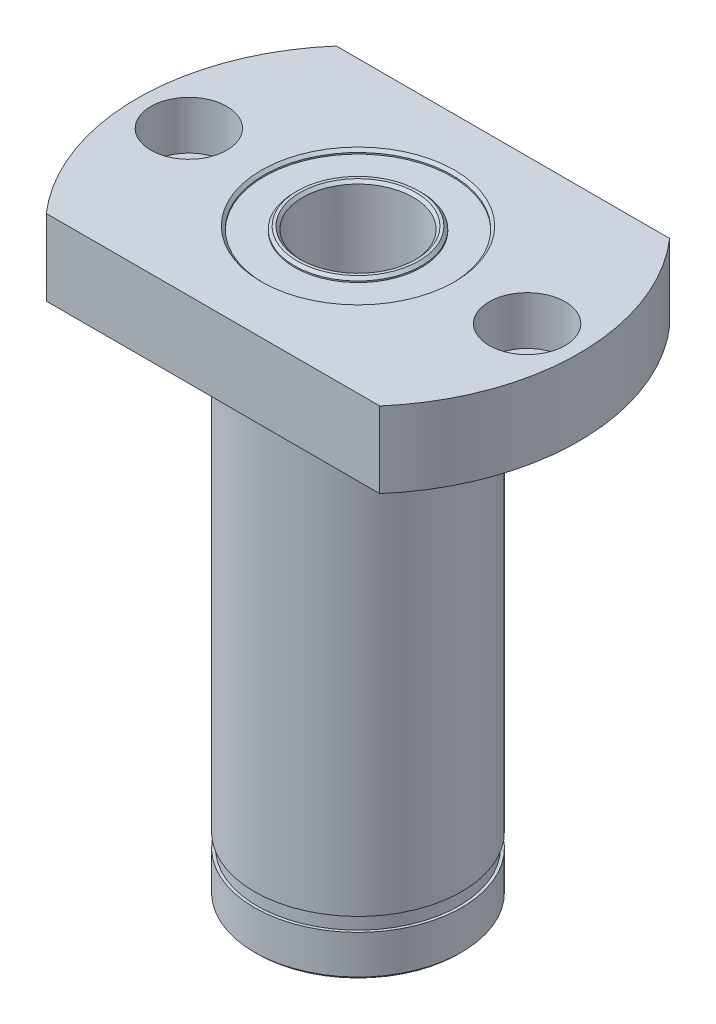
ISO-10303-21;
HEADER;
FILE_DESCRIPTION(('STEP AP214'),'2;1');
FILE_NAME('part.step','',(''),(''),'','','');
FILE_SCHEMA(('AUTOMOTIVE_DESIGN { 1 0 10303 214 1 1 1 1 }'));
ENDSEC;
DATA;
#1=APPLICATION_CONTEXT('core data for automotive mechanical design processes');
#2=APPLICATION_PROTOCOL_DEFINITION('international standard','automotive_design',2000,#1);
#3=PRODUCT_CONTEXT('',#1,'mechanical');
#4=PRODUCT('Part','Part','',(#3));
#5=PRODUCT_RELATED_PRODUCT_CATEGORY('part','',(#4));
#6=PRODUCT_DEFINITION_FORMATION('','',#4);
#7=PRODUCT_DEFINITION_CONTEXT('part definition',#1,'design');
#8=PRODUCT_DEFINITION('design','',#6,#7);
#9=PRODUCT_DEFINITION_SHAPE('','',#8);
#10=(LENGTH_UNIT() NAMED_UNIT(*) SI_UNIT(.MILLI.,.METRE.));
#11=(NAMED_UNIT(*) PLANE_ANGLE_UNIT() SI_UNIT($,.RADIAN.));
#12=(NAMED_UNIT(*) SI_UNIT($,.STERADIAN.) SOLID_ANGLE_UNIT());
#13=UNCERTAINTY_MEASURE_WITH_UNIT(LENGTH_MEASURE(1.E-05),#10,'distance_accuracy_value','');
#14=(GEOMETRIC_REPRESENTATION_CONTEXT(3) GLOBAL_UNCERTAINTY_ASSIGNED_CONTEXT((#13)) GLOBAL_UNIT_ASSIGNED_CONTEXT((#10,
#11,#12)) REPRESENTATION_CONTEXT('',''));
#15=CARTESIAN_POINT('',(0.,0.,0.));
#16=DIRECTION('',(0.,0.,1.));
#17=DIRECTION('',(1.,0.,0.));
#18=AXIS2_PLACEMENT_3D('',#15,#16,#17);
#19=CARTESIAN_POINT('',(-12.25,34.,0.));
#20=DIRECTION('',(0.,1.,0.));
#21=DIRECTION('',(0.,0.,1.));
#22=AXIS2_PLACEMENT_3D('',#19,#20,#21);
#23=CYLINDRICAL_SURFACE('',#22,1.5);
#24=CARTESIAN_POINT('',(-12.25,36.5,0.));
#25=DIRECTION('',(0.,1.,0.));
#26=DIRECTION('',(0.,0.,1.));
#27=AXIS2_PLACEMENT_3D('',#24,#25,#26);
#28=CIRCLE('',#27,1.5);
#29=CARTESIAN_POINT('',(-12.25,36.5,1.5));
#30=VERTEX_POINT('',#29);
#31=EDGE_CURVE('E328',#30,#30,#28,.T.);
#32=ORIENTED_EDGE('',*,*,#31,.F.);
#33=EDGE_LOOP('',(#32));
#34=FACE_BOUND('',#33,.T.);
#35=CARTESIAN_POINT('',(-12.25,38.5,0.));
#36=DIRECTION('',(0.,1.,0.));
#37=DIRECTION('',(0.,0.,1.));
#38=AXIS2_PLACEMENT_3D('',#35,#36,#37);
#39=CIRCLE('',#38,1.5);
#40=CARTESIAN_POINT('',(-12.25,38.5,1.5));
#41=VERTEX_POINT('',#40);
#42=EDGE_CURVE('E109',#41,#41,#39,.F.);
#43=ORIENTED_EDGE('',*,*,#42,.F.);
#44=EDGE_LOOP('',(#43));
#45=FACE_BOUND('',#44,.T.);
#46=ADVANCED_FACE('F32',(#34,#45),#23,.F.);
#47=CARTESIAN_POINT('',(12.25,34.,0.));
#48=DIRECTION('',(0.,1.,0.));
#49=DIRECTION('',(0.,0.,1.));
#50=AXIS2_PLACEMENT_3D('',#47,#48,#49);
#51=CYLINDRICAL_SURFACE('',#50,1.5);
#52=CARTESIAN_POINT('',(12.25,36.5,0.));
#53=DIRECTION('',(0.,1.,0.));
#54=DIRECTION('',(0.,0.,1.));
#55=AXIS2_PLACEMENT_3D('',#52,#53,#54);
#56=CIRCLE('',#55,1.5);
#57=CARTESIAN_POINT('',(12.25,36.5,1.5));
#58=VERTEX_POINT('',#57);
#59=EDGE_CURVE('E107',#58,#58,#56,.T.);
#60=ORIENTED_EDGE('',*,*,#59,.F.);
#61=EDGE_LOOP('',(#60));
#62=FACE_BOUND('',#61,.T.);
#63=CARTESIAN_POINT('',(12.25,38.5,0.));
#64=DIRECTION('',(0.,1.,0.));
#65=DIRECTION('',(0.,0.,1.));
#66=AXIS2_PLACEMENT_3D('',#63,#64,#65);
#67=CIRCLE('',#66,1.5);
#68=CARTESIAN_POINT('',(12.25,38.5,1.5));
#69=VERTEX_POINT('',#68);
#70=EDGE_CURVE('E104',#69,#69,#67,.F.);
#71=ORIENTED_EDGE('',*,*,#70,.F.);
#72=EDGE_LOOP('',(#71));
#73=FACE_BOUND('',#72,.T.);
#74=ADVANCED_FACE('F209',(#62,#73),#51,.F.);
#75=CARTESIAN_POINT('',(0.,36.5,0.));
#76=DIRECTION('',(0.,-1.,0.));
#77=DIRECTION('',(0.,0.,-1.));
#78=AXIS2_PLACEMENT_3D('',#75,#76,#77);
#79=CYLINDRICAL_SURFACE('',#78,7.5);
#80=CARTESIAN_POINT('',(0.,0.199999999999999,0.));
#81=DIRECTION('',(0.,1.,0.));
#82=DIRECTION('',(0.,0.,1.));
#83=AXIS2_PLACEMENT_3D('',#80,#81,#82);
#84=CIRCLE('',#83,7.5);
#85=CARTESIAN_POINT('',(0.,0.199999999999999,7.5));
#86=VERTEX_POINT('',#85);
#87=EDGE_CURVE('E11',#86,#86,#84,.T.);
#88=ORIENTED_EDGE('',*,*,#87,.T.);
#89=EDGE_LOOP('',(#88));
#90=FACE_BOUND('',#89,.T.);
#91=CARTESIAN_POINT('',(0.,3.,0.));
#92=DIRECTION('',(0.,-1.,0.));
#93=DIRECTION('',(0.,0.,-1.));
#94=AXIS2_PLACEMENT_3D('',#91,#92,#93);
#95=CIRCLE('',#94,7.5);
#96=CARTESIAN_POINT('',(0.,3.,-7.5));
#97=VERTEX_POINT('',#96);
#98=EDGE_CURVE('E178',#97,#97,#95,.T.);
#99=ORIENTED_EDGE('',*,*,#98,.T.);
#100=EDGE_LOOP('',(#99));
#101=FACE_BOUND('',#100,.T.);
#102=ADVANCED_FACE('F215',(#90,#101),#79,.T.);
#103=CARTESIAN_POINT('',(-16.,42.,10.5));
#104=DIRECTION('',(0.,1.,0.));
#105=DIRECTION('',(0.,0.,1.));
#106=AXIS2_PLACEMENT_3D('',#103,#104,#105);
#107=PLANE('',#106);
#108=CARTESIAN_POINT('',(0.,42.,0.));
#109=DIRECTION('',(0.,1.,0.));
#110=DIRECTION('',(0.,0.,1.));
#111=AXIS2_PLACEMENT_3D('',#108,#109,#110);
#112=CIRCLE('',#111,4.40000000000001);
#113=CARTESIAN_POINT('',(0.,42.,4.40000000000001));
#114=VERTEX_POINT('',#113);
#115=EDGE_CURVE('E134',#114,#114,#112,.T.);
#116=ORIENTED_EDGE('',*,*,#115,.T.);
#117=EDGE_LOOP('',(#116));
#118=FACE_BOUND('',#117,.T.);
#119=CARTESIAN_POINT('',(0.,42.,0.));
#120=DIRECTION('',(0.,1.,0.));
#121=DIRECTION('',(0.,0.,1.));
#122=AXIS2_PLACEMENT_3D('',#119,#120,#121);
#123=CIRCLE('',#122,4.19999999999996);
#124=CARTESIAN_POINT('',(0.,42.,4.19999999999996));
#125=VERTEX_POINT('',#124);
#126=EDGE_CURVE('E131',#125,#125,#123,.F.);
#127=ORIENTED_EDGE('',*,*,#126,.T.);
#128=EDGE_LOOP('',(#127));
#129=FACE_BOUND('',#128,.T.);
#130=ADVANCED_FACE('F290',(#118,#129),#107,.T.);
#131=CARTESIAN_POINT('',(0.,0.,0.));
#132=DIRECTION('',(0.,1.,0.));
#133=DIRECTION('',(0.,0.,1.));
#134=AXIS2_PLACEMENT_3D('',#131,#132,#133);
#135=PLANE('',#134);
#136=CARTESIAN_POINT('',(0.,0.,0.));
#137=DIRECTION('',(0.,1.,0.));
#138=DIRECTION('',(0.,0.,1.));
#139=AXIS2_PLACEMENT_3D('',#136,#137,#138);
#140=CIRCLE('',#139,4.40000000000001);
#141=CARTESIAN_POINT('',(0.,0.,4.40000000000001));
#142=VERTEX_POINT('',#141);
#143=EDGE_CURVE('E116',#142,#142,#140,.F.);
#144=ORIENTED_EDGE('',*,*,#143,.T.);
#145=EDGE_LOOP('',(#144));
#146=FACE_BOUND('',#145,.T.);
#147=CARTESIAN_POINT('',(0.,0.,0.));
#148=DIRECTION('',(0.,1.,0.));
#149=DIRECTION('',(0.,0.,1.));
#150=AXIS2_PLACEMENT_3D('',#147,#148,#149);
#151=CIRCLE('',#150,4.20000000000004);
#152=CARTESIAN_POINT('',(0.,0.,4.20000000000004));
#153=VERTEX_POINT('',#152);
#154=EDGE_CURVE('E79',#153,#153,#151,.T.);
#155=ORIENTED_EDGE('',*,*,#154,.T.);
#156=EDGE_LOOP('',(#155));
#157=FACE_BOUND('',#156,.T.);
#158=ADVANCED_FACE('F288',(#146,#157),#135,.F.);
#159=CARTESIAN_POINT('',(-16.,36.5,10.5));
#160=DIRECTION('',(0.,1.,0.));
#161=DIRECTION('',(0.,0.,1.));
#162=AXIS2_PLACEMENT_3D('',#159,#160,#161);
#163=PLANE('',#162);
#164=ORIENTED_EDGE('',*,*,#59,.T.);
#165=EDGE_LOOP('',(#164));
#166=FACE_BOUND('',#165,.T.);
#167=ORIENTED_EDGE('',*,*,#31,.T.);
#168=EDGE_LOOP('',(#167));
#169=FACE_BOUND('',#168,.T.);
#170=CARTESIAN_POINT('',(0.,36.5,0.));
#171=DIRECTION('',(0.,1.,0.));
#172=DIRECTION('',(0.,0.,1.));
#173=AXIS2_PLACEMENT_3D('',#170,#171,#172);
#174=CIRCLE('',#173,7.5);
#175=CARTESIAN_POINT('',(0.,36.5,7.5));
#176=VERTEX_POINT('',#175);
#177=EDGE_CURVE('E95',#176,#176,#174,.T.);
#178=ORIENTED_EDGE('',*,*,#177,.T.);
#179=EDGE_LOOP('',(#178));
#180=FACE_BOUND('',#179,.T.);
#181=CARTESIAN_POINT('',(0.,36.5,0.));
#182=DIRECTION('',(0.,1.,0.));
#183=DIRECTION('',(0.,0.,1.));
#184=AXIS2_PLACEMENT_3D('',#181,#182,#183);
#185=CIRCLE('',#184,16.);
#186=CARTESIAN_POINT('',(12.0726964676496,36.5,10.5));
#187=VERTEX_POINT('',#186);
#188=CARTESIAN_POINT('',(12.0726964676496,36.5,-10.5));
#189=VERTEX_POINT('',#188);
#190=EDGE_CURVE('E89',#187,#189,#185,.T.);
#191=ORIENTED_EDGE('',*,*,#190,.F.);
#192=DIRECTION('',(1.,0.,0.));
#193=VECTOR('',#192,1.);
#194=CARTESIAN_POINT('',(-16.,36.5,10.5));
#195=LINE('',#194,#193);
#196=CARTESIAN_POINT('',(-12.0726964676496,36.5,10.5));
#197=VERTEX_POINT('',#196);
#198=EDGE_CURVE('E88',#197,#187,#195,.T.);
#199=ORIENTED_EDGE('',*,*,#198,.F.);
#200=CARTESIAN_POINT('',(-12.0726964676496,36.5,-10.5));
#201=VERTEX_POINT('',#200);
#202=EDGE_CURVE('E186',#201,#197,#185,.T.);
#203=ORIENTED_EDGE('',*,*,#202,.F.);
#204=DIRECTION('',(-1.,0.,0.));
#205=VECTOR('',#204,1.);
#206=CARTESIAN_POINT('',(-16.,36.5,-10.5));
#207=LINE('',#206,#205);
#208=EDGE_CURVE('E93',#189,#201,#207,.T.);
#209=ORIENTED_EDGE('',*,*,#208,.F.);
#210=EDGE_LOOP('',(#191,#199,#203,#209));
#211=FACE_BOUND('',#210,.T.);
#212=ADVANCED_FACE('F194',(#166,#169,#180,#211),#163,.F.);
#213=CARTESIAN_POINT('',(-16.,42.,10.5));
#214=DIRECTION('',(0.,0.,-1.));
#215=DIRECTION('',(-1.,0.,0.));
#216=AXIS2_PLACEMENT_3D('',#213,#214,#215);
#217=PLANE('',#216);
#218=DIRECTION('',(0.,1.,0.));
#219=VECTOR('',#218,1.);
#220=CARTESIAN_POINT('',(-12.0726964676496,32.,10.5));
#221=LINE('',#220,#219);
#222=CARTESIAN_POINT('',(-12.0726964676496,42.,10.5));
#223=VERTEX_POINT('',#222);
#224=EDGE_CURVE('E55',#197,#223,#221,.T.);
#225=ORIENTED_EDGE('',*,*,#224,.F.);
#226=ORIENTED_EDGE('',*,*,#198,.T.);
#227=DIRECTION('',(0.,1.,0.));
#228=VECTOR('',#227,1.);
#229=CARTESIAN_POINT('',(12.0726964676496,32.,10.5));
#230=LINE('',#229,#228);
#231=CARTESIAN_POINT('',(12.0726964676496,42.,10.5));
#232=VERTEX_POINT('',#231);
#233=EDGE_CURVE('E73',#232,#187,#230,.F.);
#234=ORIENTED_EDGE('',*,*,#233,.F.);
#235=DIRECTION('',(1.,0.,0.));
#236=VECTOR('',#235,1.);
#237=CARTESIAN_POINT('',(-16.,42.,10.5));
#238=LINE('',#237,#236);
#239=EDGE_CURVE('E86',#223,#232,#238,.T.);
#240=ORIENTED_EDGE('',*,*,#239,.F.);
#241=EDGE_LOOP('',(#225,#226,#234,#240));
#242=FACE_BOUND('',#241,.T.);
#243=ADVANCED_FACE('F85',(#242),#217,.F.);
#244=CARTESIAN_POINT('',(-16.,42.,-10.5));
#245=DIRECTION('',(0.,0.,1.));
#246=DIRECTION('',(1.,0.,0.));
#247=AXIS2_PLACEMENT_3D('',#244,#245,#246);
#248=PLANE('',#247);
#249=DIRECTION('',(0.,1.,0.));
#250=VECTOR('',#249,1.);
#251=CARTESIAN_POINT('',(12.0726964676496,32.,-10.5));
#252=LINE('',#251,#250);
#253=CARTESIAN_POINT('',(12.0726964676496,42.,-10.5));
#254=VERTEX_POINT('',#253);
#255=EDGE_CURVE('E47',#189,#254,#252,.T.);
#256=ORIENTED_EDGE('',*,*,#255,.F.);
#257=ORIENTED_EDGE('',*,*,#208,.T.);
#258=DIRECTION('',(0.,1.,0.));
#259=VECTOR('',#258,1.);
#260=CARTESIAN_POINT('',(-12.0726964676496,32.,-10.5));
#261=LINE('',#260,#259);
#262=CARTESIAN_POINT('',(-12.0726964676496,42.,-10.5));
#263=VERTEX_POINT('',#262);
#264=EDGE_CURVE('E184',#263,#201,#261,.F.);
#265=ORIENTED_EDGE('',*,*,#264,.F.);
#266=DIRECTION('',(-1.,0.,0.));
#267=VECTOR('',#266,1.);
#268=CARTESIAN_POINT('',(-16.,42.,-10.5));
#269=LINE('',#268,#267);
#270=EDGE_CURVE('E92',#254,#263,#269,.T.);
#271=ORIENTED_EDGE('',*,*,#270,.F.);
#272=EDGE_LOOP('',(#256,#257,#265,#271));
#273=FACE_BOUND('',#272,.T.);
#274=ADVANCED_FACE('F191',(#273),#248,.F.);
#275=CARTESIAN_POINT('',(0.,42.,0.));
#276=DIRECTION('',(0.,1.,0.));
#277=DIRECTION('',(0.,0.,1.));
#278=AXIS2_PLACEMENT_3D('',#275,#276,#277);
#279=CIRCLE('',#278,7.);
#280=CARTESIAN_POINT('',(0.,42.,7.));
#281=VERTEX_POINT('',#280);
#282=EDGE_CURVE('E40',#281,#281,#279,.F.);
#283=ORIENTED_EDGE('',*,*,#282,.T.);
#284=EDGE_LOOP('',(#283));
#285=FACE_BOUND('',#284,.T.);
#286=CARTESIAN_POINT('',(-12.25,42.,0.));
#287=DIRECTION('',(0.,1.,0.));
#288=DIRECTION('',(0.,0.,1.));
#289=AXIS2_PLACEMENT_3D('',#286,#287,#288);
#290=CIRCLE('',#289,2.75);
#291=CARTESIAN_POINT('',(-12.25,42.,2.75));
#292=VERTEX_POINT('',#291);
#293=EDGE_CURVE('E113',#292,#292,#290,.T.);
#294=ORIENTED_EDGE('',*,*,#293,.F.);
#295=EDGE_LOOP('',(#294));
#296=FACE_BOUND('',#295,.T.);
#297=CARTESIAN_POINT('',(12.25,42.,0.));
#298=DIRECTION('',(0.,1.,0.));
#299=DIRECTION('',(0.,0.,1.));
#300=AXIS2_PLACEMENT_3D('',#297,#298,#299);
#301=CIRCLE('',#300,2.75);
#302=CARTESIAN_POINT('',(12.25,42.,2.75));
#303=VERTEX_POINT('',#302);
#304=EDGE_CURVE('E112',#303,#303,#301,.T.);
#305=ORIENTED_EDGE('',*,*,#304,.F.);
#306=EDGE_LOOP('',(#305));
#307=FACE_BOUND('',#306,.T.);
#308=ORIENTED_EDGE('',*,*,#239,.T.);
#309=CARTESIAN_POINT('',(0.,42.,0.));
#310=DIRECTION('',(0.,1.,0.));
#311=DIRECTION('',(0.,0.,1.));
#312=AXIS2_PLACEMENT_3D('',#309,#310,#311);
#313=CIRCLE('',#312,16.);
#314=EDGE_CURVE('E70',#232,#254,#313,.T.);
#315=ORIENTED_EDGE('',*,*,#314,.T.);
#316=ORIENTED_EDGE('',*,*,#270,.T.);
#317=EDGE_CURVE('E80',#263,#223,#313,.T.);
#318=ORIENTED_EDGE('',*,*,#317,.T.);
#319=EDGE_LOOP('',(#308,#315,#316,#318));
#320=FACE_BOUND('',#319,.T.);
#321=ADVANCED_FACE('F91',(#285,#296,#307,#320),#107,.T.);
#322=CARTESIAN_POINT('',(0.,4.,0.));
#323=DIRECTION('',(0.,-1.,0.));
#324=DIRECTION('',(0.,0.,-1.));
#325=AXIS2_PLACEMENT_3D('',#322,#323,#324);
#326=CIRCLE('',#325,7.5);
#327=CARTESIAN_POINT('',(0.,4.,-7.5));
#328=VERTEX_POINT('',#327);
#329=EDGE_CURVE('E325',#328,#328,#326,.T.);
#330=ORIENTED_EDGE('',*,*,#329,.F.);
#331=EDGE_LOOP('',(#330));
#332=FACE_BOUND('',#331,.T.);
#333=ORIENTED_EDGE('',*,*,#177,.F.);
#334=EDGE_LOOP('',(#333));
#335=FACE_BOUND('',#334,.T.);
#336=ADVANCED_FACE('F303',(#332,#335),#79,.T.);
#337=CARTESIAN_POINT('',(0.,0.,0.));
#338=DIRECTION('',(0.,1.,0.));
#339=DIRECTION('',(0.,0.,1.));
#340=AXIS2_PLACEMENT_3D('',#337,#338,#339);
#341=CIRCLE('',#340,7.00000000000001);
#342=CARTESIAN_POINT('',(0.,0.,7.00000000000001));
#343=VERTEX_POINT('',#342);
#344=EDGE_CURVE('E128',#343,#343,#341,.T.);
#345=ORIENTED_EDGE('',*,*,#344,.T.);
#346=EDGE_LOOP('',(#345));
#347=FACE_BOUND('',#346,.T.);
#348=CARTESIAN_POINT('',(0.,0.,0.));
#349=DIRECTION('',(0.,1.,0.));
#350=DIRECTION('',(0.,0.,1.));
#351=AXIS2_PLACEMENT_3D('',#348,#349,#350);
#352=CIRCLE('',#351,7.29999999999999);
#353=CARTESIAN_POINT('',(0.,0.,7.29999999999999));
#354=VERTEX_POINT('',#353);
#355=EDGE_CURVE('E125',#354,#354,#352,.F.);
#356=ORIENTED_EDGE('',*,*,#355,.T.);
#357=EDGE_LOOP('',(#356));
#358=FACE_BOUND('',#357,.T.);
#359=ADVANCED_FACE('F204',(#347,#358),#135,.F.);
#360=CARTESIAN_POINT('',(0.,42.,0.));
#361=DIRECTION('',(0.,-1.,0.));
#362=DIRECTION('',(0.,0.,-1.));
#363=AXIS2_PLACEMENT_3D('',#360,#361,#362);
#364=CYLINDRICAL_SURFACE('',#363,4.);
#365=CARTESIAN_POINT('',(0.,41.8,0.));
#366=DIRECTION('',(0.,1.,0.));
#367=DIRECTION('',(0.,0.,1.));
#368=AXIS2_PLACEMENT_3D('',#365,#366,#367);
#369=CIRCLE('',#368,4.);
#370=CARTESIAN_POINT('',(0.,41.8,-4.));
#371=VERTEX_POINT('',#370);
#372=EDGE_CURVE('E143',#371,#371,#369,.T.);
#373=CARTESIAN_POINT('',(0.,0.20000000000004,0.));
#374=DIRECTION('',(0.,1.,0.));
#375=DIRECTION('',(0.,0.,1.));
#376=AXIS2_PLACEMENT_3D('',#373,#374,#375);
#377=CIRCLE('',#376,4.);
#378=CARTESIAN_POINT('',(0.,0.200000000000033,-4.));
#379=VERTEX_POINT('',#378);
#380=EDGE_CURVE('E140',#379,#379,#377,.F.);
#381=CARTESIAN_POINT('',(0.,41.8,-4.));
#382=CARTESIAN_POINT('',(0.,41.3666666666667,-4.));
#383=CARTESIAN_POINT('',(0.,40.9333333333334,-4.));
#384=CARTESIAN_POINT('',(0.,40.0666666666667,-4.));
#385=CARTESIAN_POINT('',(0.,39.6333333333334,-4.));
#386=CARTESIAN_POINT('',(0.,38.7666666666667,-4.));
#387=CARTESIAN_POINT('',(0.,38.3333333333334,-4.));
#388=CARTESIAN_POINT('',(0.,37.4666666666667,-4.));
#389=CARTESIAN_POINT('',(0.,37.0333333333334,-4.));
#390=CARTESIAN_POINT('',(0.,36.1666666666667,-4.));
#391=CARTESIAN_POINT('',(0.,35.7333333333334,-4.));
#392=CARTESIAN_POINT('',(0.,34.8666666666667,-4.));
#393=CARTESIAN_POINT('',(0.,34.4333333333334,-4.));
#394=CARTESIAN_POINT('',(0.,33.5666666666667,-4.));
#395=CARTESIAN_POINT('',(0.,33.1333333333334,-4.));
#396=CARTESIAN_POINT('',(0.,32.2666666666667,-4.));
#397=CARTESIAN_POINT('',(0.,31.8333333333334,-4.));
#398=CARTESIAN_POINT('',(0.,30.9666666666667,-4.));
#399=CARTESIAN_POINT('',(0.,30.5333333333334,-4.));
#400=CARTESIAN_POINT('',(0.,29.6666666666667,-4.));
#401=CARTESIAN_POINT('',(0.,29.2333333333334,-4.));
#402=CARTESIAN_POINT('',(0.,28.3666666666667,-4.));
#403=CARTESIAN_POINT('',(0.,27.9333333333334,-4.));
#404=CARTESIAN_POINT('',(0.,27.0666666666667,-4.));
#405=CARTESIAN_POINT('',(0.,26.6333333333334,-4.));
#406=CARTESIAN_POINT('',(0.,25.7666666666667,-4.));
#407=CARTESIAN_POINT('',(0.,25.3333333333334,-4.));
#408=CARTESIAN_POINT('',(0.,24.4666666666667,-4.));
#409=CARTESIAN_POINT('',(0.,24.0333333333334,-4.));
#410=CARTESIAN_POINT('',(0.,23.1666666666667,-4.));
#411=CARTESIAN_POINT('',(0.,22.7333333333334,-4.));
#412=CARTESIAN_POINT('',(0.,21.8666666666667,-4.));
#413=CARTESIAN_POINT('',(0.,21.4333333333334,-4.));
#414=CARTESIAN_POINT('',(0.,20.5666666666667,-4.));
#415=CARTESIAN_POINT('',(0.,20.1333333333334,-4.));
#416=CARTESIAN_POINT('',(0.,19.2666666666667,-4.));
#417=CARTESIAN_POINT('',(0.,18.8333333333334,-4.));
#418=CARTESIAN_POINT('',(0.,17.9666666666667,-4.));
#419=CARTESIAN_POINT('',(0.,17.5333333333334,-4.));
#420=CARTESIAN_POINT('',(0.,16.6666666666667,-4.));
#421=CARTESIAN_POINT('',(0.,16.2333333333334,-4.));
#422=CARTESIAN_POINT('',(0.,15.3666666666667,-4.));
#423=CARTESIAN_POINT('',(0.,14.9333333333334,-4.));
#424=CARTESIAN_POINT('',(0.,14.0666666666667,-4.));
#425=CARTESIAN_POINT('',(0.,13.6333333333334,-4.));
#426=CARTESIAN_POINT('',(0.,12.7666666666667,-4.));
#427=CARTESIAN_POINT('',(0.,12.3333333333334,-4.));
#428=CARTESIAN_POINT('',(0.,11.4666666666667,-4.));
#429=CARTESIAN_POINT('',(0.,11.0333333333334,-4.));
#430=CARTESIAN_POINT('',(0.,10.1666666666667,-4.));
#431=CARTESIAN_POINT('',(0.,9.73333333333336,-4.));
#432=CARTESIAN_POINT('',(0.,8.8666666666667,-4.));
#433=CARTESIAN_POINT('',(0.,8.43333333333337,-4.));
#434=CARTESIAN_POINT('',(0.,7.5666666666667,-4.));
#435=CARTESIAN_POINT('',(0.,7.13333333333336,-4.));
#436=CARTESIAN_POINT('',(0.,6.26666666666669,-4.));
#437=CARTESIAN_POINT('',(0.,5.83333333333336,-4.));
#438=CARTESIAN_POINT('',(0.,4.9666666666667,-4.));
#439=CARTESIAN_POINT('',(0.,4.53333333333337,-4.));
#440=CARTESIAN_POINT('',(0.,3.6666666666667,-4.));
#441=CARTESIAN_POINT('',(0.,3.23333333333336,-4.));
#442=CARTESIAN_POINT('',(0.,2.36666666666669,-4.));
#443=CARTESIAN_POINT('',(0.,1.93333333333336,-4.));
#444=CARTESIAN_POINT('',(0.,1.0666666666667,-4.));
#445=CARTESIAN_POINT('',(0.,0.633333333333366,-4.));
#446=CARTESIAN_POINT('',(0.,0.200000000000033,-4.));
#447=B_SPLINE_CURVE_WITH_KNOTS('',3,(#381,#382,#383,#384,#385,#386,#387,#388,#389,#390,#391,
#392,#393,#394,#395,#396,#397,#398,#399,#400,#401,#402,#403,#404,#405,#406,#407,#408,#409,#410,
#411,#412,#413,#414,#415,#416,#417,#418,#419,#420,#421,#422,#423,#424,#425,#426,#427,#428,#429,
#430,#431,#432,#433,#434,#435,#436,#437,#438,#439,#440,#441,#442,#443,#444,#445,#446),
.UNSPECIFIED.,.F.,.F.,(4,2,2,2,2,2,2,2,2,2,2,2,2,2,2,2,2,2,2,2,2,2,2,2,2,2,2,2,2,2,2,2,4),(0.,
1.3,2.6,3.9,5.2,6.50000000000001,7.8,9.1,10.4,11.7,13.,14.3,15.6,16.9,18.2,19.5,20.8,22.1,23.4,
24.7,26.,27.3,28.6,29.9,31.2,32.5,33.8,35.1,36.4,37.7,39.,40.3,41.6),.UNSPECIFIED.);
#448=EDGE_CURVE('BSEAM197',#371,#379,#447,.T.);
#449=ORIENTED_EDGE('',*,*,#372,.T.);
#450=ORIENTED_EDGE('',*,*,#380,.T.);
#451=ORIENTED_EDGE('',*,*,#448,.T.);
#452=ORIENTED_EDGE('',*,*,#448,.F.);
#453=EDGE_LOOP('',(#449,#451,#450,#452));
#454=FACE_BOUND('',#453,.T.);
#455=ADVANCED_FACE('F197',(#454),#364,.F.);
#456=CARTESIAN_POINT('',(0.,32.,0.));
#457=DIRECTION('',(0.,1.,0.));
#458=DIRECTION('',(0.,0.,1.));
#459=AXIS2_PLACEMENT_3D('',#456,#457,#458);
#460=CYLINDRICAL_SURFACE('',#459,16.);
#461=ORIENTED_EDGE('',*,*,#202,.T.);
#462=ORIENTED_EDGE('',*,*,#224,.T.);
#463=ORIENTED_EDGE('',*,*,#317,.F.);
#464=ORIENTED_EDGE('',*,*,#264,.T.);
#465=EDGE_LOOP('',(#461,#462,#463,#464));
#466=FACE_BOUND('',#465,.T.);
#467=ADVANCED_FACE('F195',(#466),#460,.T.);
#468=ORIENTED_EDGE('',*,*,#190,.T.);
#469=ORIENTED_EDGE('',*,*,#255,.T.);
#470=ORIENTED_EDGE('',*,*,#314,.F.);
#471=ORIENTED_EDGE('',*,*,#233,.T.);
#472=EDGE_LOOP('',(#468,#469,#470,#471));
#473=FACE_BOUND('',#472,.T.);
#474=ADVANCED_FACE('F72',(#473),#460,.T.);
#475=CARTESIAN_POINT('',(0.,0.3,0.));
#476=DIRECTION('',(0.,-1.,0.));
#477=DIRECTION('',(0.,0.,-1.));
#478=AXIS2_PLACEMENT_3D('',#475,#476,#477);
#479=CYLINDRICAL_SURFACE('',#478,6.8);
#480=CARTESIAN_POINT('',(0.,0.200000000000009,0.));
#481=DIRECTION('',(0.,1.,0.));
#482=DIRECTION('',(0.,0.,1.));
#483=AXIS2_PLACEMENT_3D('',#480,#481,#482);
#484=CIRCLE('',#483,6.8);
#485=CARTESIAN_POINT('',(0.,0.200000000000009,6.8));
#486=VERTEX_POINT('',#485);
#487=EDGE_CURVE('E122',#486,#486,#484,.F.);
#488=ORIENTED_EDGE('',*,*,#487,.T.);
#489=EDGE_LOOP('',(#488));
#490=FACE_BOUND('',#489,.T.);
#491=CARTESIAN_POINT('',(0.,0.3,0.));
#492=DIRECTION('',(0.,-1.,0.));
#493=DIRECTION('',(0.,0.,-1.));
#494=AXIS2_PLACEMENT_3D('',#491,#492,#493);
#495=CIRCLE('',#494,6.8);
#496=CARTESIAN_POINT('',(0.,0.3,-6.8));
#497=VERTEX_POINT('',#496);
#498=EDGE_CURVE('E175',#497,#497,#495,.T.);
#499=ORIENTED_EDGE('',*,*,#498,.F.);
#500=EDGE_LOOP('',(#499));
#501=FACE_BOUND('',#500,.T.);
#502=ADVANCED_FACE('F203',(#490,#501),#479,.F.);
#503=CARTESIAN_POINT('',(0.,0.3,0.));
#504=DIRECTION('',(0.,-1.,0.));
#505=DIRECTION('',(0.,0.,-1.));
#506=AXIS2_PLACEMENT_3D('',#503,#504,#505);
#507=PLANE('',#506);
#508=CARTESIAN_POINT('',(0.,0.3,0.));
#509=DIRECTION('',(0.,-1.,0.));
#510=DIRECTION('',(0.,0.,-1.));
#511=AXIS2_PLACEMENT_3D('',#508,#509,#510);
#512=CIRCLE('',#511,4.6);
#513=CARTESIAN_POINT('',(0.,0.3,-4.6));
#514=VERTEX_POINT('',#513);
#515=EDGE_CURVE('E171',#514,#514,#512,.T.);
#516=ORIENTED_EDGE('',*,*,#515,.F.);
#517=EDGE_LOOP('',(#516));
#518=FACE_BOUND('',#517,.T.);
#519=ORIENTED_EDGE('',*,*,#498,.T.);
#520=EDGE_LOOP('',(#519));
#521=FACE_BOUND('',#520,.T.);
#522=ADVANCED_FACE('F244',(#518,#521),#507,.T.);
#523=CARTESIAN_POINT('',(0.,0.3,0.));
#524=DIRECTION('',(0.,-1.,0.));
#525=DIRECTION('',(0.,0.,-1.));
#526=AXIS2_PLACEMENT_3D('',#523,#524,#525);
#527=CYLINDRICAL_SURFACE('',#526,4.6);
#528=CARTESIAN_POINT('',(0.,0.199999999999988,0.));
#529=DIRECTION('',(0.,1.,0.));
#530=DIRECTION('',(0.,0.,1.));
#531=AXIS2_PLACEMENT_3D('',#528,#529,#530);
#532=CIRCLE('',#531,4.6);
#533=CARTESIAN_POINT('',(0.,0.199999999999988,4.6));
#534=VERTEX_POINT('',#533);
#535=EDGE_CURVE('E119',#534,#534,#532,.T.);
#536=ORIENTED_EDGE('',*,*,#535,.T.);
#537=EDGE_LOOP('',(#536));
#538=FACE_BOUND('',#537,.T.);
#539=ORIENTED_EDGE('',*,*,#515,.T.);
#540=EDGE_LOOP('',(#539));
#541=FACE_BOUND('',#540,.T.);
#542=ADVANCED_FACE('F165',(#538,#541),#527,.T.);
#543=CARTESIAN_POINT('',(0.,41.7,0.));
#544=DIRECTION('',(0.,1.,0.));
#545=DIRECTION('',(0.,0.,1.));
#546=AXIS2_PLACEMENT_3D('',#543,#544,#545);
#547=CYLINDRICAL_SURFACE('',#546,6.8);
#548=CARTESIAN_POINT('',(0.,41.8,0.));
#549=DIRECTION('',(0.,1.,0.));
#550=DIRECTION('',(0.,0.,1.));
#551=AXIS2_PLACEMENT_3D('',#548,#549,#550);
#552=CIRCLE('',#551,6.8);
#553=CARTESIAN_POINT('',(0.,41.8,6.8));
#554=VERTEX_POINT('',#553);
#555=EDGE_CURVE('E146',#554,#554,#552,.T.);
#556=ORIENTED_EDGE('',*,*,#555,.T.);
#557=EDGE_LOOP('',(#556));
#558=FACE_BOUND('',#557,.T.);
#559=CARTESIAN_POINT('',(0.,41.7,0.));
#560=DIRECTION('',(0.,1.,0.));
#561=DIRECTION('',(0.,0.,1.));
#562=AXIS2_PLACEMENT_3D('',#559,#560,#561);
#563=CIRCLE('',#562,6.8);
#564=CARTESIAN_POINT('',(0.,41.7,6.8));
#565=VERTEX_POINT('',#564);
#566=EDGE_CURVE('E169',#565,#565,#563,.T.);
#567=ORIENTED_EDGE('',*,*,#566,.F.);
#568=EDGE_LOOP('',(#567));
#569=FACE_BOUND('',#568,.T.);
#570=ADVANCED_FACE('F161',(#558,#569),#547,.F.);
#571=CARTESIAN_POINT('',(0.,41.7,0.));
#572=DIRECTION('',(0.,1.,0.));
#573=DIRECTION('',(0.,0.,1.));
#574=AXIS2_PLACEMENT_3D('',#571,#572,#573);
#575=PLANE('',#574);
#576=CARTESIAN_POINT('',(0.,41.7,0.));
#577=DIRECTION('',(0.,1.,0.));
#578=DIRECTION('',(0.,0.,1.));
#579=AXIS2_PLACEMENT_3D('',#576,#577,#578);
#580=CIRCLE('',#579,4.6);
#581=CARTESIAN_POINT('',(0.,41.7,4.6));
#582=VERTEX_POINT('',#581);
#583=EDGE_CURVE('E172',#582,#582,#580,.T.);
#584=ORIENTED_EDGE('',*,*,#583,.F.);
#585=EDGE_LOOP('',(#584));
#586=FACE_BOUND('',#585,.T.);
#587=ORIENTED_EDGE('',*,*,#566,.T.);
#588=EDGE_LOOP('',(#587));
#589=FACE_BOUND('',#588,.T.);
#590=ADVANCED_FACE('F164',(#586,#589),#575,.T.);
#591=CARTESIAN_POINT('',(0.,41.7,0.));
#592=DIRECTION('',(0.,1.,0.));
#593=DIRECTION('',(0.,0.,1.));
#594=AXIS2_PLACEMENT_3D('',#591,#592,#593);
#595=CYLINDRICAL_SURFACE('',#594,4.6);
#596=CARTESIAN_POINT('',(0.,41.8,0.));
#597=DIRECTION('',(0.,1.,0.));
#598=DIRECTION('',(0.,0.,1.));
#599=AXIS2_PLACEMENT_3D('',#596,#597,#598);
#600=CIRCLE('',#599,4.6);
#601=CARTESIAN_POINT('',(0.,41.8,4.6));
#602=VERTEX_POINT('',#601);
#603=EDGE_CURVE('E137',#602,#602,#600,.F.);
#604=ORIENTED_EDGE('',*,*,#603,.T.);
#605=EDGE_LOOP('',(#604));
#606=FACE_BOUND('',#605,.T.);
#607=ORIENTED_EDGE('',*,*,#583,.T.);
#608=EDGE_LOOP('',(#607));
#609=FACE_BOUND('',#608,.T.);
#610=ADVANCED_FACE('F234',(#606,#609),#595,.T.);
#611=CARTESIAN_POINT('',(0.,3.,-7.5));
#612=DIRECTION('',(0.,-1.,0.));
#613=DIRECTION('',(0.,0.,-1.));
#614=AXIS2_PLACEMENT_3D('',#611,#612,#613);
#615=PLANE('',#614);
#616=ORIENTED_EDGE('',*,*,#98,.F.);
#617=EDGE_LOOP('',(#616));
#618=FACE_BOUND('',#617,.T.);
#619=CARTESIAN_POINT('',(0.,3.,0.));
#620=DIRECTION('',(0.,-1.,0.));
#621=DIRECTION('',(0.,0.,-1.));
#622=AXIS2_PLACEMENT_3D('',#619,#620,#621);
#623=CIRCLE('',#622,7.3);
#624=CARTESIAN_POINT('',(0.,3.,-7.3));
#625=VERTEX_POINT('',#624);
#626=EDGE_CURVE('E318',#625,#625,#623,.T.);
#627=ORIENTED_EDGE('',*,*,#626,.T.);
#628=EDGE_LOOP('',(#627));
#629=FACE_BOUND('',#628,.T.);
#630=ADVANCED_FACE('F230',(#618,#629),#615,.F.);
#631=CARTESIAN_POINT('',(0.,0.,0.));
#632=DIRECTION('',(0.,-1.,0.));
#633=DIRECTION('',(0.,0.,-1.));
#634=AXIS2_PLACEMENT_3D('',#631,#632,#633);
#635=CYLINDRICAL_SURFACE('',#634,7.3);
#636=ORIENTED_EDGE('',*,*,#626,.F.);
#637=EDGE_LOOP('',(#636));
#638=FACE_BOUND('',#637,.T.);
#639=CARTESIAN_POINT('',(0.,4.,0.));
#640=DIRECTION('',(0.,-1.,0.));
#641=DIRECTION('',(0.,0.,-1.));
#642=AXIS2_PLACEMENT_3D('',#639,#640,#641);
#643=CIRCLE('',#642,7.3);
#644=CARTESIAN_POINT('',(0.,4.,-7.3));
#645=VERTEX_POINT('',#644);
#646=EDGE_CURVE('E320',#645,#645,#643,.T.);
#647=ORIENTED_EDGE('',*,*,#646,.T.);
#648=EDGE_LOOP('',(#647));
#649=FACE_BOUND('',#648,.T.);
#650=ADVANCED_FACE('F226',(#638,#649),#635,.T.);
#651=CARTESIAN_POINT('',(0.,4.,-7.5));
#652=DIRECTION('',(0.,1.,0.));
#653=DIRECTION('',(0.,0.,1.));
#654=AXIS2_PLACEMENT_3D('',#651,#652,#653);
#655=PLANE('',#654);
#656=ORIENTED_EDGE('',*,*,#646,.F.);
#657=EDGE_LOOP('',(#656));
#658=FACE_BOUND('',#657,.T.);
#659=ORIENTED_EDGE('',*,*,#329,.T.);
#660=EDGE_LOOP('',(#659));
#661=FACE_BOUND('',#660,.T.);
#662=ADVANCED_FACE('F222',(#658,#661),#655,.F.);
#663=CARTESIAN_POINT('',(12.25,38.5,0.));
#664=DIRECTION('',(0.,1.,0.));
#665=DIRECTION('',(0.,0.,1.));
#666=AXIS2_PLACEMENT_3D('',#663,#664,#665);
#667=PLANE('',#666);
#668=CARTESIAN_POINT('',(12.25,38.5,0.));
#669=DIRECTION('',(0.,1.,0.));
#670=DIRECTION('',(0.,0.,1.));
#671=AXIS2_PLACEMENT_3D('',#668,#669,#670);
#672=CIRCLE('',#671,2.75);
#673=CARTESIAN_POINT('',(12.25,38.5,2.75));
#674=VERTEX_POINT('',#673);
#675=EDGE_CURVE('E108',#674,#674,#672,.T.);
#676=ORIENTED_EDGE('',*,*,#675,.T.);
#677=EDGE_LOOP('',(#676));
#678=FACE_BOUND('',#677,.T.);
#679=ORIENTED_EDGE('',*,*,#70,.T.);
#680=EDGE_LOOP('',(#679));
#681=FACE_BOUND('',#680,.T.);
#682=ADVANCED_FACE('F225',(#678,#681),#667,.T.);
#683=CARTESIAN_POINT('',(12.25,38.5,0.));
#684=DIRECTION('',(0.,1.,0.));
#685=DIRECTION('',(0.,0.,1.));
#686=AXIS2_PLACEMENT_3D('',#683,#684,#685);
#687=CYLINDRICAL_SURFACE('',#686,2.75);
#688=ORIENTED_EDGE('',*,*,#675,.F.);
#689=EDGE_LOOP('',(#688));
#690=FACE_BOUND('',#689,.T.);
#691=ORIENTED_EDGE('',*,*,#304,.T.);
#692=EDGE_LOOP('',(#691));
#693=FACE_BOUND('',#692,.T.);
#694=ADVANCED_FACE('F347',(#690,#693),#687,.F.);
#695=CARTESIAN_POINT('',(-12.25,38.5,0.));
#696=DIRECTION('',(0.,1.,0.));
#697=DIRECTION('',(0.,0.,1.));
#698=AXIS2_PLACEMENT_3D('',#695,#696,#697);
#699=PLANE('',#698);
#700=CARTESIAN_POINT('',(-12.25,38.5,0.));
#701=DIRECTION('',(0.,1.,0.));
#702=DIRECTION('',(0.,0.,1.));
#703=AXIS2_PLACEMENT_3D('',#700,#701,#702);
#704=CIRCLE('',#703,2.75);
#705=CARTESIAN_POINT('',(-12.25,38.5,2.75));
#706=VERTEX_POINT('',#705);
#707=EDGE_CURVE('E337',#706,#706,#704,.T.);
#708=ORIENTED_EDGE('',*,*,#707,.T.);
#709=EDGE_LOOP('',(#708));
#710=FACE_BOUND('',#709,.T.);
#711=ORIENTED_EDGE('',*,*,#42,.T.);
#712=EDGE_LOOP('',(#711));
#713=FACE_BOUND('',#712,.T.);
#714=ADVANCED_FACE('F349',(#710,#713),#699,.T.);
#715=CARTESIAN_POINT('',(-12.25,38.5,0.));
#716=DIRECTION('',(0.,1.,0.));
#717=DIRECTION('',(0.,0.,1.));
#718=AXIS2_PLACEMENT_3D('',#715,#716,#717);
#719=CYLINDRICAL_SURFACE('',#718,2.75);
#720=ORIENTED_EDGE('',*,*,#707,.F.);
#721=EDGE_LOOP('',(#720));
#722=FACE_BOUND('',#721,.T.);
#723=ORIENTED_EDGE('',*,*,#293,.T.);
#724=EDGE_LOOP('',(#723));
#725=FACE_BOUND('',#724,.T.);
#726=ADVANCED_FACE('F269',(#722,#725),#719,.F.);
#727=CARTESIAN_POINT('',(0.,0.,0.));
#728=DIRECTION('',(0.,1.,0.));
#729=DIRECTION('',(0.,0.,1.));
#730=AXIS2_PLACEMENT_3D('',#727,#728,#729);
#731=CONICAL_SURFACE('',#730,4.40000000000001,0.785398163397457);
#732=CARTESIAN_POINT('',(0.,0.199999999999988,4.6));
#733=CARTESIAN_POINT('',(0.,0.197916666666655,4.59791666666667));
#734=CARTESIAN_POINT('',(0.,0.195833333333322,4.59583333333333));
#735=CARTESIAN_POINT('',(0.,0.191666666666656,4.59166666666667));
#736=CARTESIAN_POINT('',(0.,0.189583333333322,4.58958333333333));
#737=CARTESIAN_POINT('',(0.,0.185416666666656,4.58541666666667));
#738=CARTESIAN_POINT('',(0.,0.183333333333323,4.58333333333333));
#739=CARTESIAN_POINT('',(0.,0.179166666666656,4.57916666666667));
#740=CARTESIAN_POINT('',(0.,0.177083333333323,4.57708333333333));
#741=CARTESIAN_POINT('',(0.,0.172916666666657,4.57291666666667));
#742=CARTESIAN_POINT('',(0.,0.170833333333323,4.57083333333333));
#743=CARTESIAN_POINT('',(0.,0.166666666666657,4.56666666666667));
#744=CARTESIAN_POINT('',(0.,0.164583333333324,4.56458333333333));
#745=CARTESIAN_POINT('',(0.,0.160416666666657,4.56041666666667));
#746=CARTESIAN_POINT('',(0.,0.158333333333324,4.55833333333334));
#747=CARTESIAN_POINT('',(0.,0.154166666666658,4.55416666666667));
#748=CARTESIAN_POINT('',(0.,0.152083333333325,4.55208333333333));
#749=CARTESIAN_POINT('',(0.,0.147916666666658,4.54791666666667));
#750=CARTESIAN_POINT('',(0.,0.145833333333325,4.54583333333334));
#751=CARTESIAN_POINT('',(0.,0.141666666666658,4.54166666666667));
#752=CARTESIAN_POINT('',(0.,0.139583333333325,4.53958333333334));
#753=CARTESIAN_POINT('',(0.,0.135416666666659,4.53541666666667));
#754=CARTESIAN_POINT('',(0.,0.133333333333326,4.53333333333334));
#755=CARTESIAN_POINT('',(0.,0.129166666666659,4.52916666666667));
#756=CARTESIAN_POINT('',(0.,0.127083333333326,4.52708333333334));
#757=CARTESIAN_POINT('',(0.,0.12291666666666,4.52291666666667));
#758=CARTESIAN_POINT('',(0.,0.120833333333326,4.52083333333334));
#759=CARTESIAN_POINT('',(0.,0.11666666666666,4.51666666666667));
#760=CARTESIAN_POINT('',(0.,0.114583333333327,4.51458333333334));
#761=CARTESIAN_POINT('',(0.,0.11041666666666,4.51041666666667));
#762=CARTESIAN_POINT('',(0.,0.108333333333327,4.50833333333334));
#763=CARTESIAN_POINT('',(0.,0.104166666666661,4.50416666666667));
#764=CARTESIAN_POINT('',(0.,0.102083333333327,4.50208333333334));
#765=CARTESIAN_POINT('',(0.,0.0979166666666611,4.49791666666667));
#766=CARTESIAN_POINT('',(0.,0.0958333333333277,4.49583333333334));
#767=CARTESIAN_POINT('',(0.,0.0916666666666613,4.49166666666667));
#768=CARTESIAN_POINT('',(0.,0.0895833333333282,4.48958333333334));
#769=CARTESIAN_POINT('',(0.,0.0854166666666618,4.48541666666667));
#770=CARTESIAN_POINT('',(0.,0.0833333333333284,4.48333333333334));
#771=CARTESIAN_POINT('',(0.,0.079166666666662,4.47916666666667));
#772=CARTESIAN_POINT('',(0.,0.0770833333333289,4.47708333333334));
#773=CARTESIAN_POINT('',(0.,0.0729166666666625,4.47291666666667));
#774=CARTESIAN_POINT('',(0.,0.0708333333333292,4.47083333333334));
#775=CARTESIAN_POINT('',(0.,0.0666666666666627,4.46666666666667));
#776=CARTESIAN_POINT('',(0.,0.0645833333333297,4.46458333333334));
#777=CARTESIAN_POINT('',(0.,0.0604166666666632,4.46041666666667));
#778=CARTESIAN_POINT('',(0.,0.0583333333333299,4.45833333333334));
#779=CARTESIAN_POINT('',(0.,0.0541666666666635,4.45416666666667));
#780=CARTESIAN_POINT('',(0.,0.0520833333333304,4.45208333333334));
#781=CARTESIAN_POINT('',(0.,0.0479166666666639,4.44791666666667));
#782=CARTESIAN_POINT('',(0.,0.0458333333333306,4.44583333333334));
#783=CARTESIAN_POINT('',(0.,0.0416666666666641,4.44166666666667));
#784=CARTESIAN_POINT('',(0.,0.039583333333331,4.43958333333334));
#785=CARTESIAN_POINT('',(0.,0.0354166666666646,4.43541666666667));
#786=CARTESIAN_POINT('',(0.,0.0333333333333315,4.43333333333334));
#787=CARTESIAN_POINT('',(0.,0.029166666666665,4.42916666666667));
#788=CARTESIAN_POINT('',(0.,0.0270833333333318,4.42708333333334));
#789=CARTESIAN_POINT('',(0.,0.0229166666666653,4.42291666666667));
#790=CARTESIAN_POINT('',(0.,0.020833333333332,4.42083333333334));
#791=CARTESIAN_POINT('',(0.,0.0166666666666656,4.41666666666667));
#792=CARTESIAN_POINT('',(0.,0.0145833333333325,4.41458333333334));
#793=CARTESIAN_POINT('',(0.,0.0104166666666661,4.41041666666667));
#794=CARTESIAN_POINT('',(0.,0.0083333333333329,4.40833333333334));
#795=CARTESIAN_POINT('',(0.,0.00416666666666652,4.40416666666667));
#796=CARTESIAN_POINT('',(0.,0.00208333333333333,4.40208333333334));
#797=CARTESIAN_POINT('',(0.,0.,4.40000000000001));
#798=B_SPLINE_CURVE_WITH_KNOTS('',3,(#732,#733,#734,#735,#736,#737,#738,#739,#740,#741,#742,
#743,#744,#745,#746,#747,#748,#749,#750,#751,#752,#753,#754,#755,#756,#757,#758,#759,#760,#761,
#762,#763,#764,#765,#766,#767,#768,#769,#770,#771,#772,#773,#774,#775,#776,#777,#778,#779,#780,
#781,#782,#783,#784,#785,#786,#787,#788,#789,#790,#791,#792,#793,#794,#795,#796,#797),
.UNSPECIFIED.,.F.,.F.,(4,2,2,2,2,2,2,2,2,2,2,2,2,2,2,2,2,2,2,2,2,2,2,2,2,2,2,2,2,2,2,2,4),(0.,
0.0088388347648311,0.0176776695296628,0.0265165042944939,0.0353553390593256,0.0441941738241567,
0.0530330085889884,0.0618718433538196,0.0707106781186513,0.0795495128834824,0.0883883476483141,
0.0972271824131452,0.106066017177977,0.114904851942808,0.12374368670764,0.132582521472471,
0.141421356237303,0.150260191002134,0.159099025766965,0.167937860531796,0.176776695296628,
0.185615530061459,0.194454364826291,0.203293199591122,0.212132034355954,0.220970869120785,
0.229809703885617,0.238648538650448,0.247487373415279,0.256326208180111,0.265165042944942,
0.274003877709774,0.282842712474605),.UNSPECIFIED.);
#799=EDGE_CURVE('BSEAM260',#534,#142,#798,.T.);
#800=ORIENTED_EDGE('',*,*,#535,.F.);
#801=ORIENTED_EDGE('',*,*,#143,.F.);
#802=ORIENTED_EDGE('',*,*,#799,.T.);
#803=ORIENTED_EDGE('',*,*,#799,.F.);
#804=EDGE_LOOP('',(#800,#802,#801,#803));
#805=FACE_BOUND('',#804,.T.);
#806=ADVANCED_FACE('F260',(#805),#731,.T.);
#807=CARTESIAN_POINT('',(0.,0.200000000000009,0.));
#808=DIRECTION('',(0.,-1.,0.));
#809=DIRECTION('',(0.,0.,-1.));
#810=AXIS2_PLACEMENT_3D('',#807,#808,#809);
#811=CONICAL_SURFACE('',#810,6.8,0.785398163397459);
#812=ORIENTED_EDGE('',*,*,#344,.F.);
#813=EDGE_LOOP('',(#812));
#814=FACE_BOUND('',#813,.T.);
#815=ORIENTED_EDGE('',*,*,#487,.F.);
#816=EDGE_LOOP('',(#815));
#817=FACE_BOUND('',#816,.T.);
#818=ADVANCED_FACE('F257',(#814,#817),#811,.F.);
#819=CARTESIAN_POINT('',(0.,42.,0.));
#820=DIRECTION('',(0.,-1.,0.));
#821=DIRECTION('',(0.,0.,-1.));
#822=AXIS2_PLACEMENT_3D('',#819,#820,#821);
#823=CONICAL_SURFACE('',#822,4.40000000000001,0.785398163397448);
#824=ORIENTED_EDGE('',*,*,#603,.F.);
#825=EDGE_LOOP('',(#824));
#826=FACE_BOUND('',#825,.T.);
#827=ORIENTED_EDGE('',*,*,#115,.F.);
#828=EDGE_LOOP('',(#827));
#829=FACE_BOUND('',#828,.T.);
#830=ADVANCED_FACE('F259',(#826,#829),#823,.T.);
#831=CARTESIAN_POINT('',(0.,42.,0.));
#832=DIRECTION('',(0.,1.,0.));
#833=DIRECTION('',(0.,0.,1.));
#834=AXIS2_PLACEMENT_3D('',#831,#832,#833);
#835=CONICAL_SURFACE('',#834,4.19999999999996,0.785398163397455);
#836=ORIENTED_EDGE('',*,*,#372,.F.);
#837=EDGE_LOOP('',(#836));
#838=FACE_BOUND('',#837,.T.);
#839=ORIENTED_EDGE('',*,*,#126,.F.);
#840=EDGE_LOOP('',(#839));
#841=FACE_BOUND('',#840,.T.);
#842=ADVANCED_FACE('F157',(#838,#841),#835,.F.);
#843=CARTESIAN_POINT('',(0.,41.8,0.));
#844=DIRECTION('',(0.,1.,0.));
#845=DIRECTION('',(0.,0.,1.));
#846=AXIS2_PLACEMENT_3D('',#843,#844,#845);
#847=CONICAL_SURFACE('',#846,6.8,0.78539816339745);
#848=ORIENTED_EDGE('',*,*,#282,.F.);
#849=EDGE_LOOP('',(#848));
#850=FACE_BOUND('',#849,.T.);
#851=ORIENTED_EDGE('',*,*,#555,.F.);
#852=EDGE_LOOP('',(#851));
#853=FACE_BOUND('',#852,.T.);
#854=ADVANCED_FACE('F153',(#850,#853),#847,.F.);
#855=CARTESIAN_POINT('',(0.,0.20000000000004,0.));
#856=DIRECTION('',(0.,-1.,0.));
#857=DIRECTION('',(0.,0.,-1.));
#858=AXIS2_PLACEMENT_3D('',#855,#856,#857);
#859=CONICAL_SURFACE('',#858,4.,0.785398163397455);
#860=ORIENTED_EDGE('',*,*,#154,.F.);
#861=EDGE_LOOP('',(#860));
#862=FACE_BOUND('',#861,.T.);
#863=ORIENTED_EDGE('',*,*,#380,.F.);
#864=EDGE_LOOP('',(#863));
#865=FACE_BOUND('',#864,.T.);
#866=ADVANCED_FACE('F156',(#862,#865),#859,.F.);
#867=CARTESIAN_POINT('',(0.,0.199999999999999,0.));
#868=DIRECTION('',(0.,1.,0.));
#869=DIRECTION('',(0.,0.,1.));
#870=AXIS2_PLACEMENT_3D('',#867,#868,#869);
#871=CONICAL_SURFACE('',#870,7.5,0.785398163397463);
#872=ORIENTED_EDGE('',*,*,#355,.F.);
#873=EDGE_LOOP('',(#872));
#874=FACE_BOUND('',#873,.T.);
#875=ORIENTED_EDGE('',*,*,#87,.F.);
#876=EDGE_LOOP('',(#875));
#877=FACE_BOUND('',#876,.T.);
#878=ADVANCED_FACE('F34',(#874,#877),#871,.T.);
#879=CLOSED_SHELL('',(#46,#74,#102,#130,#158,#212,#243,#274,#321,#336,#359,#455,#467,#474,#502,
#522,#542,#570,#590,#610,#630,#650,#662,#682,#694,#714,#726,#806,#818,#830,#842,#854,#866,#878));
#880=MANIFOLD_SOLID_BREP('B2',#879);
#881=ADVANCED_BREP_SHAPE_REPRESENTATION('',(#18,#880),#14);
#882=SHAPE_DEFINITION_REPRESENTATION(#9,#881);
ENDSEC;
END-ISO-10303-21;
